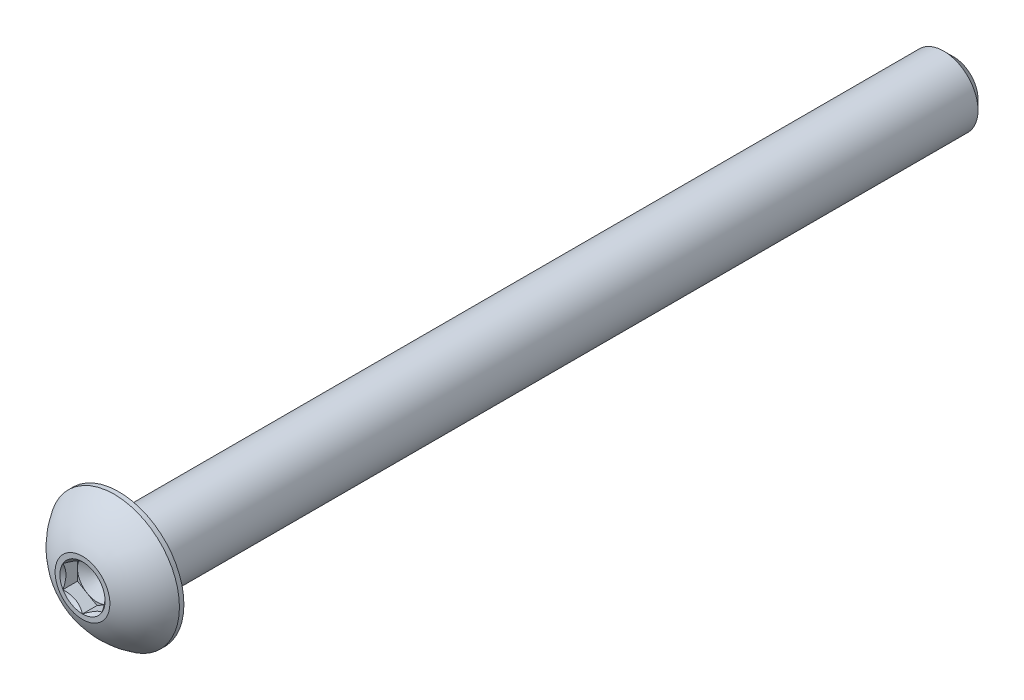
ISO-10303-21;
HEADER;
FILE_DESCRIPTION(('STEP AP214'),'2;1');
FILE_NAME('part.step','',(''),(''),'','','');
FILE_SCHEMA(('AUTOMOTIVE_DESIGN { 1 0 10303 214 1 1 1 1 }'));
ENDSEC;
DATA;
#1=APPLICATION_CONTEXT('core data for automotive mechanical design processes');
#2=APPLICATION_PROTOCOL_DEFINITION('international standard','automotive_design',2000,#1);
#3=PRODUCT_CONTEXT('',#1,'mechanical');
#4=PRODUCT('Part','Part','',(#3));
#5=PRODUCT_RELATED_PRODUCT_CATEGORY('part','',(#4));
#6=PRODUCT_DEFINITION_FORMATION('','',#4);
#7=PRODUCT_DEFINITION_CONTEXT('part definition',#1,'design');
#8=PRODUCT_DEFINITION('design','',#6,#7);
#9=PRODUCT_DEFINITION_SHAPE('','',#8);
#10=(LENGTH_UNIT() NAMED_UNIT(*) SI_UNIT(.MILLI.,.METRE.));
#11=(NAMED_UNIT(*) PLANE_ANGLE_UNIT() SI_UNIT($,.RADIAN.));
#12=(NAMED_UNIT(*) SI_UNIT($,.STERADIAN.) SOLID_ANGLE_UNIT());
#13=UNCERTAINTY_MEASURE_WITH_UNIT(LENGTH_MEASURE(1.E-05),#10,'distance_accuracy_value','');
#14=(GEOMETRIC_REPRESENTATION_CONTEXT(3) GLOBAL_UNCERTAINTY_ASSIGNED_CONTEXT((#13)) GLOBAL_UNIT_ASSIGNED_CONTEXT((#10,
#11,#12)) REPRESENTATION_CONTEXT('',''));
#15=CARTESIAN_POINT('',(0.,0.,0.));
#16=DIRECTION('',(0.,0.,1.));
#17=DIRECTION('',(1.,0.,0.));
#18=AXIS2_PLACEMENT_3D('',#15,#16,#17);
#19=CARTESIAN_POINT('',(0.,1.190625,26.5049));
#20=DIRECTION('',(0.,0.,-1.));
#21=DIRECTION('',(-1.,0.,0.));
#22=AXIS2_PLACEMENT_3D('',#19,#20,#21);
#23=PLANE('',#22);
#24=CARTESIAN_POINT('',(0.,0.,26.5049));
#25=DIRECTION('',(0.,0.,1.));
#26=DIRECTION('',(1.,0.,0.));
#27=AXIS2_PLACEMENT_3D('',#24,#25,#26);
#28=CIRCLE('',#27,1.666875);
#29=CARTESIAN_POINT('',(0.,1.66687500000001,26.5049));
#30=VERTEX_POINT('',#29);
#31=EDGE_CURVE('E167',#30,#30,#28,.T.);
#32=ORIENTED_EDGE('',*,*,#31,.T.);
#33=EDGE_LOOP('',(#32));
#34=FACE_BOUND('',#33,.T.);
#35=CARTESIAN_POINT('',(0.,0.,26.5049));
#36=DIRECTION('',(0.,0.,1.));
#37=DIRECTION('',(1.,0.,0.));
#38=AXIS2_PLACEMENT_3D('',#35,#36,#37);
#39=CIRCLE('',#38,1.3748153285078);
#40=CARTESIAN_POINT('',(0.,1.3748153285078,26.5049));
#41=VERTEX_POINT('',#40);
#42=CARTESIAN_POINT('',(-1.190625,0.687407664253898,26.5049));
#43=VERTEX_POINT('',#42);
#44=EDGE_CURVE('E121',#41,#43,#39,.T.);
#45=ORIENTED_EDGE('',*,*,#44,.F.);
#46=CARTESIAN_POINT('',(0.,0.,26.5049));
#47=DIRECTION('',(0.,0.,1.));
#48=DIRECTION('',(1.,0.,0.));
#49=AXIS2_PLACEMENT_3D('',#46,#47,#48);
#50=CIRCLE('',#49,1.3748153285078);
#51=CARTESIAN_POINT('',(1.190625,0.687407664253897,26.5049));
#52=VERTEX_POINT('',#51);
#53=EDGE_CURVE('E106',#52,#41,#50,.T.);
#54=ORIENTED_EDGE('',*,*,#53,.F.);
#55=CARTESIAN_POINT('',(0.,0.,26.5049));
#56=DIRECTION('',(0.,0.,1.));
#57=DIRECTION('',(1.,0.,0.));
#58=AXIS2_PLACEMENT_3D('',#55,#56,#57);
#59=CIRCLE('',#58,1.3748153285078);
#60=CARTESIAN_POINT('',(1.190625,-0.687407664253896,26.5049));
#61=VERTEX_POINT('',#60);
#62=EDGE_CURVE('E117',#61,#52,#59,.T.);
#63=ORIENTED_EDGE('',*,*,#62,.F.);
#64=CARTESIAN_POINT('',(0.,0.,26.5049));
#65=DIRECTION('',(0.,0.,1.));
#66=DIRECTION('',(1.,0.,0.));
#67=AXIS2_PLACEMENT_3D('',#64,#65,#66);
#68=CIRCLE('',#67,1.3748153285078);
#69=CARTESIAN_POINT('',(0.,-1.3748153285078,26.5049));
#70=VERTEX_POINT('',#69);
#71=EDGE_CURVE('E138',#70,#61,#68,.T.);
#72=ORIENTED_EDGE('',*,*,#71,.F.);
#73=CARTESIAN_POINT('',(0.,0.,26.5049));
#74=DIRECTION('',(0.,0.,1.));
#75=DIRECTION('',(1.,0.,0.));
#76=AXIS2_PLACEMENT_3D('',#73,#74,#75);
#77=CIRCLE('',#76,1.3748153285078);
#78=CARTESIAN_POINT('',(-1.190625,-0.6874076642539,26.5049));
#79=VERTEX_POINT('',#78);
#80=EDGE_CURVE('E438',#79,#70,#77,.T.);
#81=ORIENTED_EDGE('',*,*,#80,.F.);
#82=CARTESIAN_POINT('',(0.,0.,26.5049));
#83=DIRECTION('',(0.,0.,1.));
#84=DIRECTION('',(1.,0.,0.));
#85=AXIS2_PLACEMENT_3D('',#82,#83,#84);
#86=CIRCLE('',#85,1.3748153285078);
#87=EDGE_CURVE('E447',#43,#79,#86,.T.);
#88=ORIENTED_EDGE('',*,*,#87,.F.);
#89=EDGE_LOOP('',(#45,#54,#63,#72,#81,#88));
#90=FACE_BOUND('',#89,.T.);
#91=ADVANCED_FACE('F33',(#34,#90),#23,.F.);
#92=CARTESIAN_POINT('',(0.,0.,-26.5049));
#93=DIRECTION('',(0.,0.,1.));
#94=DIRECTION('',(1.,0.,0.));
#95=AXIS2_PLACEMENT_3D('',#92,#93,#94);
#96=CONICAL_SURFACE('',#95,1.4874875,0.785398163397447);
#97=CARTESIAN_POINT('',(0.,0.,-25.9095875));
#98=DIRECTION('',(0.,0.,1.));
#99=DIRECTION('',(1.,0.,0.));
#100=AXIS2_PLACEMENT_3D('',#97,#98,#99);
#101=CIRCLE('',#100,2.0828);
#102=CARTESIAN_POINT('',(2.0828,0.,-25.9095875));
#103=VERTEX_POINT('',#102);
#104=EDGE_CURVE('E11',#103,#103,#101,.T.);
#105=ORIENTED_EDGE('',*,*,#104,.F.);
#106=EDGE_LOOP('',(#105));
#107=FACE_BOUND('',#106,.T.);
#108=CARTESIAN_POINT('',(0.,0.,-26.5049));
#109=DIRECTION('',(0.,0.,1.));
#110=DIRECTION('',(1.,0.,0.));
#111=AXIS2_PLACEMENT_3D('',#108,#109,#110);
#112=CIRCLE('',#111,1.4874875);
#113=CARTESIAN_POINT('',(1.4874875,0.,-26.5049));
#114=VERTEX_POINT('',#113);
#115=EDGE_CURVE('E160',#114,#114,#112,.T.);
#116=ORIENTED_EDGE('',*,*,#115,.T.);
#117=EDGE_LOOP('',(#116));
#118=FACE_BOUND('',#117,.T.);
#119=ADVANCED_FACE('F35',(#107,#118),#96,.T.);
#120=CARTESIAN_POINT('',(0.,0.,26.5049));
#121=DIRECTION('',(0.,0.,1.));
#122=DIRECTION('',(1.,0.,0.));
#123=AXIS2_PLACEMENT_3D('',#120,#121,#122);
#124=CYLINDRICAL_SURFACE('',#123,2.0828);
#125=CARTESIAN_POINT('',(0.,0.,24.2951));
#126=DIRECTION('',(0.,0.,1.));
#127=DIRECTION('',(1.,0.,0.));
#128=AXIS2_PLACEMENT_3D('',#125,#126,#127);
#129=CIRCLE('',#128,2.0828);
#130=CARTESIAN_POINT('',(2.0828,0.,24.2951));
#131=VERTEX_POINT('',#130);
#132=EDGE_CURVE('E41',#131,#131,#129,.T.);
#133=ORIENTED_EDGE('',*,*,#132,.F.);
#134=EDGE_LOOP('',(#133));
#135=FACE_BOUND('',#134,.T.);
#136=ORIENTED_EDGE('',*,*,#104,.T.);
#137=EDGE_LOOP('',(#136));
#138=FACE_BOUND('',#137,.T.);
#139=ADVANCED_FACE('F181',(#135,#138),#124,.T.);
#140=CARTESIAN_POINT('',(0.,3.9624,24.2951));
#141=DIRECTION('',(0.,0.,1.));
#142=DIRECTION('',(1.,0.,0.));
#143=AXIS2_PLACEMENT_3D('',#140,#141,#142);
#144=PLANE('',#143);
#145=CARTESIAN_POINT('',(0.,0.,24.2951));
#146=DIRECTION('',(0.,0.,1.));
#147=DIRECTION('',(1.,0.,0.));
#148=AXIS2_PLACEMENT_3D('',#145,#146,#147);
#149=CIRCLE('',#148,3.9624);
#150=CARTESIAN_POINT('',(3.9624,0.,24.2951));
#151=VERTEX_POINT('',#150);
#152=EDGE_CURVE('E174',#151,#151,#149,.T.);
#153=ORIENTED_EDGE('',*,*,#152,.F.);
#154=EDGE_LOOP('',(#153));
#155=FACE_BOUND('',#154,.T.);
#156=ORIENTED_EDGE('',*,*,#132,.T.);
#157=EDGE_LOOP('',(#156));
#158=FACE_BOUND('',#157,.T.);
#159=ADVANCED_FACE('F179',(#155,#158),#144,.F.);
#160=CARTESIAN_POINT('',(0.,0.,26.5049));
#161=DIRECTION('',(0.,0.,1.));
#162=DIRECTION('',(1.,0.,0.));
#163=AXIS2_PLACEMENT_3D('',#160,#161,#162);
#164=CYLINDRICAL_SURFACE('',#163,3.9624);
#165=CARTESIAN_POINT('',(0.,0.,24.5672428571429));
#166=DIRECTION('',(0.,0.,1.));
#167=DIRECTION('',(1.,0.,0.));
#168=AXIS2_PLACEMENT_3D('',#165,#166,#167);
#169=CIRCLE('',#168,3.9624);
#170=CARTESIAN_POINT('',(0.,3.9624,24.5672428571429));
#171=VERTEX_POINT('',#170);
#172=EDGE_CURVE('E171',#171,#171,#169,.T.);
#173=ORIENTED_EDGE('',*,*,#172,.F.);
#174=EDGE_LOOP('',(#173));
#175=FACE_BOUND('',#174,.T.);
#176=ORIENTED_EDGE('',*,*,#152,.T.);
#177=EDGE_LOOP('',(#176));
#178=FACE_BOUND('',#177,.T.);
#179=ADVANCED_FACE('F200',(#175,#178),#164,.T.);
#180=CARTESIAN_POINT('',(0.,0.,22.2015956824338));
#181=DIRECTION('',(0.,0.,1.));
#182=DIRECTION('',(0.,1.,0.));
#183=AXIS2_PLACEMENT_3D('',#180,#181,#182);
#184=SPHERICAL_SURFACE('',#183,4.61485647828933);
#185=CARTESIAN_POINT('',(0.,1.66687500000001,26.5049));
#186=CARTESIAN_POINT('',(0.,1.69659544142796,26.4933879101518));
#187=CARTESIAN_POINT('',(0.,1.72619658358825,26.4815678352273));
#188=CARTESIAN_POINT('',(0.,1.78514764747728,26.4573169960083));
#189=CARTESIAN_POINT('',(0.,1.81449756920602,26.4448862317139));
#190=CARTESIAN_POINT('',(0.,1.87293357033575,26.4194192945378));
#191=CARTESIAN_POINT('',(0.,1.90201964973674,26.4063831216561));
#192=CARTESIAN_POINT('',(0.,1.95991548647109,26.3797109782168));
#193=CARTESIAN_POINT('',(0.,1.98872524380446,26.3660750076592));
#194=CARTESIAN_POINT('',(0.,2.04605606753841,26.3382091184341));
#195=CARTESIAN_POINT('',(0.,2.07457713393898,26.3239791997667));
#196=CARTESIAN_POINT('',(0.,2.13131833294382,26.2949315238966));
#197=CARTESIAN_POINT('',(0.,2.15953846554809,26.2801137666941));
#198=CARTESIAN_POINT('',(0.,2.21566568272341,26.2498967743201));
#199=CARTESIAN_POINT('',(0.,2.24357276729446,26.2344975391486));
#200=CARTESIAN_POINT('',(0.,2.29906190869825,26.2031242013775));
#201=CARTESIAN_POINT('',(0.,2.32664396553098,26.1871500987778));
#202=CARTESIAN_POINT('',(0.,2.38147121123847,26.1546338833683));
#203=CARTESIAN_POINT('',(0.,2.40871640011324,26.1380917705586));
#204=CARTESIAN_POINT('',(0.,2.46285821430391,26.1044466358044));
#205=CARTESIAN_POINT('',(0.,2.48975483961981,26.0873436138599));
#206=CARTESIAN_POINT('',(0.,2.54318798071768,26.0525840026871));
#207=CARTESIAN_POINT('',(0.,2.56972449649964,26.0349274134588));
#208=CARTESIAN_POINT('',(0.,2.6224260271403,25.9990682472024));
#209=CARTESIAN_POINT('',(0.,2.64859104199901,25.9808656701742));
#210=CARTESIAN_POINT('',(0.,2.70053833887869,25.943922342179));
#211=CARTESIAN_POINT('',(0.,2.72632062089967,25.9251815912118));
#212=CARTESIAN_POINT('',(0.,2.77749138448606,25.8871699602226));
#213=CARTESIAN_POINT('',(0.,2.80287986605148,25.8678990802006));
#214=CARTESIAN_POINT('',(0.,2.85325213015648,25.8288354635553));
#215=CARTESIAN_POINT('',(0.,2.87823591269608,25.8090427269321));
#216=CARTESIAN_POINT('',(0.,2.92778805390526,25.7689438935568));
#217=CARTESIAN_POINT('',(0.,2.95235641257484,25.7486377968048));
#218=CARTESIAN_POINT('',(0.,3.00106715952974,25.7075209600153));
#219=CARTESIAN_POINT('',(0.,3.02520954781505,25.686710219978));
#220=CARTESIAN_POINT('',(0.,3.0730579903444,25.6445930300909));
#221=CARTESIAN_POINT('',(0.,3.09676404458844,25.6232865802411));
#222=CARTESIAN_POINT('',(0.,3.14372964268434,25.5801871169966));
#223=CARTESIAN_POINT('',(0.,3.1669891865362,25.5583941036018));
#224=CARTESIAN_POINT('',(0.,3.21305177917134,25.5143308684028));
#225=CARTESIAN_POINT('',(0.,3.23585482795462,25.4920606465986));
#226=CARTESIAN_POINT('',(0.,3.28099464173685,25.4470525545686));
#227=CARTESIAN_POINT('',(0.,3.3033314067358,25.4243146843429));
#228=CARTESIAN_POINT('',(0.,3.3475290643964,25.3783810562063));
#229=CARTESIAN_POINT('',(0.,3.36938995705805,25.3551852982954));
#230=CARTESIAN_POINT('',(0.,3.41262648576942,25.3083458520833));
#231=CARTESIAN_POINT('',(0.,3.43400212181915,25.284702163782));
#232=CARTESIAN_POINT('',(0.,3.47625896134093,25.2369770063688));
#233=CARTESIAN_POINT('',(0.,3.49714016481299,25.2128955372568));
#234=CARTESIAN_POINT('',(0.,3.53839917545351,25.1643051557252));
#235=CARTESIAN_POINT('',(0.,3.55877698262196,25.1397962433055));
#236=CARTESIAN_POINT('',(0.,3.59902045304723,25.0903614961659));
#237=CARTESIAN_POINT('',(0.,3.61888611630403,25.0654356614459));
#238=CARTESIAN_POINT('',(0.,3.65809677105815,25.0151777696305));
#239=CARTESIAN_POINT('',(0.,3.67744176255547,24.9898457125351));
#240=CARTESIAN_POINT('',(0.,3.71560276978466,24.9387862504814));
#241=CARTESIAN_POINT('',(0.,3.73441878551654,24.9130588455231));
#242=CARTESIAN_POINT('',(0.,3.77151376304466,24.8612197311933));
#243=CARTESIAN_POINT('',(0.,3.78979272484091,24.8351080218217));
#244=CARTESIAN_POINT('',(0.,3.82580575149333,24.7825115099777));
#245=CARTESIAN_POINT('',(0.,3.8435398163495,24.7560267075054));
#246=CARTESIAN_POINT('',(0.,3.87845542277172,24.7026953701386));
#247=CARTESIAN_POINT('',(0.,3.89563696433778,24.6758488352441));
#248=CARTESIAN_POINT('',(0.,3.92944019940812,24.6218055892715));
#249=CARTESIAN_POINT('',(0.,3.94606189291241,24.5946088781934));
#250=CARTESIAN_POINT('',(0.,3.9624,24.5672428571429));
#251=B_SPLINE_CURVE_WITH_KNOTS('',3,(#185,#186,#187,#188,#189,#190,#191,#192,#193,#194,#195,
#196,#197,#198,#199,#200,#201,#202,#203,#204,#205,#206,#207,#208,#209,#210,#211,#212,#213,#214,
#215,#216,#217,#218,#219,#220,#221,#222,#223,#224,#225,#226,#227,#228,#229,#230,#231,#232,#233,
#234,#235,#236,#237,#238,#239,#240,#241,#242,#243,#244,#245,#246,#247,#248,#249,#250),
.UNSPECIFIED.,.F.,.F.,(4,2,2,2,2,2,2,2,2,2,2,2,2,2,2,2,2,2,2,2,2,2,2,2,2,2,2,2,2,2,2,2,4),(0.,
0.0956146851543019,0.191229370308603,0.286844055462906,0.382458740617208,0.478073425771509,
0.573688110925813,0.669302796080113,0.764917481234416,0.860532166388717,0.95614685154302,
1.05176153669732,1.14737622185162,1.24299090700592,1.33860559216023,1.43422027731453,
1.52983496246883,1.62544964762313,1.72106433277744,1.81667901793174,1.91229370308604,
2.00790838824034,2.10352307339464,2.19913775854895,2.29475244370325,2.39036712885755,
2.48598181401185,2.58159649916615,2.67721118432045,2.77282586947476,2.86844055462906,
2.96405523978336,3.05966992493766),.UNSPECIFIED.);
#252=EDGE_CURVE('BSEAM192',#30,#171,#251,.T.);
#253=ORIENTED_EDGE('',*,*,#31,.F.);
#254=ORIENTED_EDGE('',*,*,#172,.T.);
#255=ORIENTED_EDGE('',*,*,#252,.T.);
#256=ORIENTED_EDGE('',*,*,#252,.F.);
#257=EDGE_LOOP('',(#253,#255,#254,#256));
#258=FACE_BOUND('',#257,.T.);
#259=ADVANCED_FACE('F192',(#258),#184,.T.);
#260=CARTESIAN_POINT('',(0.,1.4874875,-26.5049));
#261=DIRECTION('',(0.,0.,1.));
#262=DIRECTION('',(1.,0.,0.));
#263=AXIS2_PLACEMENT_3D('',#260,#261,#262);
#264=PLANE('',#263);
#265=ORIENTED_EDGE('',*,*,#115,.F.);
#266=EDGE_LOOP('',(#265));
#267=FACE_BOUND('',#266,.T.);
#268=ADVANCED_FACE('F190',(#267),#264,.F.);
#269=CARTESIAN_POINT('',(1.190625,0.687407664253899,26.5049));
#270=DIRECTION('',(-0.499999999999999,-0.866025403784439,0.));
#271=DIRECTION('',(0.866025403784439,-0.499999999999999,0.));
#272=AXIS2_PLACEMENT_3D('',#269,#270,#271);
#273=PLANE('',#272);
#274=CARTESIAN_POINT('',(1.190825,0.687292194200061,26.5050154846));
#275=CARTESIAN_POINT('',(1.14989058041014,0.710925692369386,26.4813987642143));
#276=CARTESIAN_POINT('',(1.10827161169803,0.734954415158721,26.4591687817231));
#277=CARTESIAN_POINT('',(1.02340555632637,0.78395185507261,26.4184656626274));
#278=CARTESIAN_POINT('',(0.980150392709039,0.808925235430916,26.4000151826476));
#279=CARTESIAN_POINT('',(0.892928352542575,0.859282903800292,26.3684088380043));
#280=CARTESIAN_POINT('',(0.848983705042075,0.884654357864149,26.3551735042433));
#281=CARTESIAN_POINT('',(0.760126625836306,0.935956016463003,26.3347814515754));
#282=CARTESIAN_POINT('',(0.715216911165245,0.96188465231757,26.327609502896));
#283=CARTESIAN_POINT('',(0.637820872343021,1.00656927616579,26.3211385386489));
#284=CARTESIAN_POINT('',(0.605434587484353,1.025267506447,26.3201803201468));
#285=CARTESIAN_POINT('',(0.54071892668223,1.06263111063189,26.3217926490721));
#286=CARTESIAN_POINT('',(0.508389564872727,1.08129647637533,26.3243639751796));
#287=CARTESIAN_POINT('',(0.444042843928515,1.11844707303394,26.3328867539936));
#288=CARTESIAN_POINT('',(0.412025803663231,1.13693211984976,26.3388413547526));
#289=CARTESIAN_POINT('',(0.348526236603542,1.17359361198509,26.3538099640712));
#290=CARTESIAN_POINT('',(0.317043945355835,1.19176992131166,26.3628252859121));
#291=CARTESIAN_POINT('',(0.236410161427874,1.23832385816825,26.389582295838));
#292=CARTESIAN_POINT('',(0.187767164732343,1.2664079054046,26.409336814436));
#293=CARTESIAN_POINT('',(0.0923855836478813,1.32147648691945,26.4538367689577));
#294=CARTESIAN_POINT('',(0.0456413824128437,1.34846426408555,26.4785659647162));
#295=CARTESIAN_POINT('',(-0.00020000000000096,1.37493079856163,26.5050154846));
#296=B_SPLINE_CURVE_WITH_KNOTS('',3,(#274,#275,#276,#277,#278,#279,#280,#281,#282,#283,#284,
#285,#286,#287,#288,#289,#290,#291,#292,#293,#294,#295),.UNSPECIFIED.,.F.,.F.,(4,2,2,2,2,2,2,2,
2,2,4),(0.,0.15862567293412,0.318176079843272,0.475191357500657,0.631811068630749,
0.743878551794719,0.85597076300703,0.968167444423243,1.08041232768377,1.25873351645467,
1.43648174479847),.UNSPECIFIED.);
#297=EDGE_CURVE('E103',#52,#41,#296,.T.);
#298=ORIENTED_EDGE('',*,*,#297,.T.);
#299=DIRECTION('',(0.,0.,-1.));
#300=VECTOR('',#299,1.);
#301=CARTESIAN_POINT('',(0.,1.3748153285078,26.5049));
#302=LINE('',#301,#300);
#303=CARTESIAN_POINT('',(0.,1.3748153285078,25.62098));
#304=VERTEX_POINT('',#303);
#305=EDGE_CURVE('E158',#41,#304,#302,.T.);
#306=ORIENTED_EDGE('',*,*,#305,.T.);
#307=DIRECTION('',(-0.866025403784439,0.499999999999999,0.));
#308=VECTOR('',#307,1.);
#309=CARTESIAN_POINT('',(1.190625,0.687407664253899,25.62098));
#310=LINE('',#309,#308);
#311=CARTESIAN_POINT('',(0.595312499999999,1.03111149638085,25.62098));
#312=VERTEX_POINT('',#311);
#313=EDGE_CURVE('E474',#312,#304,#310,.T.);
#314=ORIENTED_EDGE('',*,*,#313,.F.);
#315=CARTESIAN_POINT('',(1.190625,0.687407664253899,25.62098));
#316=VERTEX_POINT('',#315);
#317=EDGE_CURVE('E48',#316,#312,#310,.T.);
#318=ORIENTED_EDGE('',*,*,#317,.F.);
#319=DIRECTION('',(0.,0.,-1.));
#320=VECTOR('',#319,1.);
#321=CARTESIAN_POINT('',(1.190625,0.687407664253899,26.5049));
#322=LINE('',#321,#320);
#323=EDGE_CURVE('E134',#52,#316,#322,.T.);
#324=ORIENTED_EDGE('',*,*,#323,.F.);
#325=EDGE_LOOP('',(#298,#306,#314,#318,#324));
#326=FACE_BOUND('',#325,.T.);
#327=ADVANCED_FACE('F140',(#326),#273,.T.);
#328=CARTESIAN_POINT('',(0.,1.3748153285078,26.5049));
#329=DIRECTION('',(0.5,-0.866025403784439,0.));
#330=DIRECTION('',(0.866025403784439,0.5,0.));
#331=AXIS2_PLACEMENT_3D('',#328,#329,#330);
#332=PLANE('',#331);
#333=CARTESIAN_POINT('',(0.00019999999999949,1.37493079856163,26.5050154846));
#334=CARTESIAN_POINT('',(-0.0407344195898564,1.35129730039231,26.4813987642143));
#335=CARTESIAN_POINT('',(-0.082353388301974,1.32726857760297,26.4591687817231));
#336=CARTESIAN_POINT('',(-0.167219443673633,1.27827113768908,26.4184656626274));
#337=CARTESIAN_POINT('',(-0.210474607290962,1.25329775733078,26.4000151826476));
#338=CARTESIAN_POINT('',(-0.297696647457426,1.2029400889614,26.3684088380043));
#339=CARTESIAN_POINT('',(-0.341641294957927,1.17756863489755,26.3551735042433));
#340=CARTESIAN_POINT('',(-0.430498374163695,1.12626697629869,26.3347814515754));
#341=CARTESIAN_POINT('',(-0.475408088834756,1.10033834044412,26.327609502896));
#342=CARTESIAN_POINT('',(-0.552804127656979,1.0556537165959,26.3211385386489));
#343=CARTESIAN_POINT('',(-0.585190412515647,1.0369554863147,26.3201803201468));
#344=CARTESIAN_POINT('',(-0.649906073317771,0.999591882129809,26.3217926490721));
#345=CARTESIAN_POINT('',(-0.682235435127273,0.980926516386364,26.3243639751796));
#346=CARTESIAN_POINT('',(-0.746582156071486,0.943775919727753,26.3328867539936));
#347=CARTESIAN_POINT('',(-0.778599196336769,0.925290872911937,26.3388413547526));
#348=CARTESIAN_POINT('',(-0.842098763396458,0.8886293807766,26.3538099640712));
#349=CARTESIAN_POINT('',(-0.873581054644165,0.87045307145003,26.3628252859121));
#350=CARTESIAN_POINT('',(-0.954214838572128,0.823899134593443,26.389582295838));
#351=CARTESIAN_POINT('',(-1.00285783526766,0.795815087357088,26.409336814436));
#352=CARTESIAN_POINT('',(-1.09823941635212,0.740746505842242,26.4538367689577));
#353=CARTESIAN_POINT('',(-1.14498361758716,0.71375872867614,26.4785659647162));
#354=CARTESIAN_POINT('',(-1.190825,0.68729219420006,26.5050154846));
#355=B_SPLINE_CURVE_WITH_KNOTS('',3,(#333,#334,#335,#336,#337,#338,#339,#340,#341,#342,#343,
#344,#345,#346,#347,#348,#349,#350,#351,#352,#353,#354),.UNSPECIFIED.,.F.,.F.,(4,2,2,2,2,2,2,2,
2,2,4),(0.,0.158625672934121,0.318176079843273,0.475191357500658,0.631811068630749,
0.743878551794719,0.85597076300703,0.968167444423243,1.08041232768377,1.25873351645467,
1.43648174479847),.UNSPECIFIED.);
#356=EDGE_CURVE('E462',#41,#43,#355,.T.);
#357=ORIENTED_EDGE('',*,*,#356,.T.);
#358=DIRECTION('',(0.,0.,-1.));
#359=VECTOR('',#358,1.);
#360=CARTESIAN_POINT('',(-1.190625,0.687407664253898,26.5049));
#361=LINE('',#360,#359);
#362=CARTESIAN_POINT('',(-1.190625,0.687407664253898,25.62098));
#363=VERTEX_POINT('',#362);
#364=EDGE_CURVE('E155',#43,#363,#361,.T.);
#365=ORIENTED_EDGE('',*,*,#364,.T.);
#366=DIRECTION('',(-0.866025403784438,-0.5,0.));
#367=VECTOR('',#366,1.);
#368=CARTESIAN_POINT('',(0.,1.3748153285078,25.62098));
#369=LINE('',#368,#367);
#370=CARTESIAN_POINT('',(-0.5953125,1.03111149638085,25.62098));
#371=VERTEX_POINT('',#370);
#372=EDGE_CURVE('E476',#371,#363,#369,.T.);
#373=ORIENTED_EDGE('',*,*,#372,.F.);
#374=EDGE_CURVE('E477',#304,#371,#369,.T.);
#375=ORIENTED_EDGE('',*,*,#374,.F.);
#376=ORIENTED_EDGE('',*,*,#305,.F.);
#377=EDGE_LOOP('',(#357,#365,#373,#375,#376));
#378=FACE_BOUND('',#377,.T.);
#379=ADVANCED_FACE('F198',(#378),#332,.T.);
#380=CARTESIAN_POINT('',(-1.190625,0.687407664253898,26.5049));
#381=DIRECTION('',(1.,0.,0.));
#382=DIRECTION('',(0.,0.,-1.));
#383=AXIS2_PLACEMENT_3D('',#380,#381,#382);
#384=PLANE('',#383);
#385=CARTESIAN_POINT('',(-1.190625,-1.33257496176315,26.9170776539471));
#386=CARTESIAN_POINT('',(-1.190625,-1.29994871423567,26.8927517507382));
#387=CARTESIAN_POINT('',(-1.190625,-1.26713658172592,26.8686758153419));
#388=CARTESIAN_POINT('',(-1.190625,-1.20106652666898,26.8211258905442));
#389=CARTESIAN_POINT('',(-1.190625,-1.16780849029641,26.7976520594744));
#390=CARTESIAN_POINT('',(-1.190625,-1.06676850998873,26.7279528021059));
#391=CARTESIAN_POINT('',(-1.190625,-0.998216816413861,26.6828244430562));
#392=CARTESIAN_POINT('',(-1.190625,-0.854708873099824,26.5945746038978));
#393=CARTESIAN_POINT('',(-1.190625,-0.779606053905837,26.5516886379598));
#394=CARTESIAN_POINT('',(-1.190625,-0.625699933788274,26.4734827621873));
#395=CARTESIAN_POINT('',(-1.190625,-0.546910204142432,26.4381374138711));
#396=CARTESIAN_POINT('',(-1.190625,-0.428270822863891,26.3949081103375));
#397=CARTESIAN_POINT('',(-1.190625,-0.390097157889893,26.3824393065679));
#398=CARTESIAN_POINT('',(-1.190625,-0.312861852648325,26.3605717414076));
#399=CARTESIAN_POINT('',(-1.190625,-0.273800148194846,26.3511732026896));
#400=CARTESIAN_POINT('',(-1.190625,-0.19565680432425,26.3360809931601));
#401=CARTESIAN_POINT('',(-1.190625,-0.156587167585192,26.3303261223414));
#402=CARTESIAN_POINT('',(-1.190625,-0.0780721925504554,26.3226274936869));
#403=CARTESIAN_POINT('',(-1.190625,-0.0386269124664328,26.3206831547062));
#404=CARTESIAN_POINT('',(-1.190625,0.0389916055329472,26.3207358865562));
#405=CARTESIAN_POINT('',(-1.190625,0.0771649838909024,26.3226082985348));
#406=CARTESIAN_POINT('',(-1.190625,0.153169316901308,26.329925032677));
#407=CARTESIAN_POINT('',(-1.190625,0.191000202066013,26.3353700639159));
#408=CARTESIAN_POINT('',(-1.190625,0.266679875667626,26.3496337404319));
#409=CARTESIAN_POINT('',(-1.190625,0.304517960496566,26.3585083513185));
#410=CARTESIAN_POINT('',(-1.190625,0.379371812103033,26.3791711899478));
#411=CARTESIAN_POINT('',(-1.190625,0.41638766004582,26.3909591287024));
#412=CARTESIAN_POINT('',(-1.190625,0.534752604370335,26.4330388624574));
#413=CARTESIAN_POINT('',(-1.190625,0.614367820141192,26.4681973626664));
#414=CARTESIAN_POINT('',(-1.190625,0.769840121594399,26.5463109296483));
#415=CARTESIAN_POINT('',(-1.190625,0.845682198950469,26.5892943854746));
#416=CARTESIAN_POINT('',(-1.190625,0.990597219171114,26.6779106157189));
#417=CARTESIAN_POINT('',(-1.190625,1.05981896192243,26.7233030277464));
#418=CARTESIAN_POINT('',(-1.190625,1.16180435559073,26.7934487362735));
#419=CARTESIAN_POINT('',(-1.190625,1.19535834820321,26.8170729140236));
#420=CARTESIAN_POINT('',(-1.190625,1.26200934527367,26.8649391402926));
#421=CARTESIAN_POINT('',(-1.190625,1.2951064717025,26.8891810187836));
#422=CARTESIAN_POINT('',(-1.190625,1.32801361492664,26.9136788103185));
#423=B_SPLINE_CURVE_WITH_KNOTS('',3,(#385,#386,#387,#388,#389,#390,#391,#392,#393,#394,#395,
#396,#397,#398,#399,#400,#401,#402,#403,#404,#405,#406,#407,#408,#409,#410,#411,#412,#413,#414,
#415,#416,#417,#418,#419,#420,#421,#422),.UNSPECIFIED.,.F.,.F.,(4,2,2,2,2,2,2,2,2,2,2,2,2,2,2,2,
2,2,4),(0.,0.122086892163024,0.244205566236856,0.490307097949239,0.749538212338043,
1.00788046850429,1.12825296528966,1.24863419022022,1.36693571627758,1.48521919874151,
1.59970134751388,1.71420622500211,1.83066442982697,1.94711108719178,2.20743843130379,
2.46872978374271,2.71694010916469,2.84004418874365,2.96311474121228),.UNSPECIFIED.);
#424=EDGE_CURVE('E455',#43,#79,#423,.F.);
#425=ORIENTED_EDGE('',*,*,#424,.T.);
#426=DIRECTION('',(0.,0.,-1.));
#427=VECTOR('',#426,1.);
#428=CARTESIAN_POINT('',(-1.190625,-0.687407664253899,26.5049));
#429=LINE('',#428,#427);
#430=CARTESIAN_POINT('',(-1.190625,-0.687407664253899,25.62098));
#431=VERTEX_POINT('',#430);
#432=EDGE_CURVE('E152',#79,#431,#429,.T.);
#433=ORIENTED_EDGE('',*,*,#432,.T.);
#434=DIRECTION('',(0.,-1.,0.));
#435=VECTOR('',#434,1.);
#436=CARTESIAN_POINT('',(-1.190625,0.687407664253898,25.62098));
#437=LINE('',#436,#435);
#438=CARTESIAN_POINT('',(-1.190625,0.,25.62098));
#439=VERTEX_POINT('',#438);
#440=EDGE_CURVE('E480',#439,#431,#437,.T.);
#441=ORIENTED_EDGE('',*,*,#440,.F.);
#442=EDGE_CURVE('E481',#363,#439,#437,.T.);
#443=ORIENTED_EDGE('',*,*,#442,.F.);
#444=ORIENTED_EDGE('',*,*,#364,.F.);
#445=EDGE_LOOP('',(#425,#433,#441,#443,#444));
#446=FACE_BOUND('',#445,.T.);
#447=ADVANCED_FACE('F319',(#446),#384,.T.);
#448=CARTESIAN_POINT('',(-1.190625,-0.687407664253899,26.5049));
#449=DIRECTION('',(0.499999999999999,0.866025403784439,0.));
#450=DIRECTION('',(-0.866025403784439,0.499999999999999,0.));
#451=AXIS2_PLACEMENT_3D('',#448,#449,#450);
#452=PLANE('',#451);
#453=CARTESIAN_POINT('',(-1.190825,-0.687292194200061,26.5050154846));
#454=CARTESIAN_POINT('',(-1.14989058041014,-0.710925692369386,26.4813987642143));
#455=CARTESIAN_POINT('',(-1.10827161169803,-0.734954415158721,26.4591687817231));
#456=CARTESIAN_POINT('',(-1.02340555632637,-0.78395185507261,26.4184656626274));
#457=CARTESIAN_POINT('',(-0.980150392709039,-0.808925235430916,26.4000151826476));
#458=CARTESIAN_POINT('',(-0.892928352542576,-0.859282903800292,26.3684088380043));
#459=CARTESIAN_POINT('',(-0.848983705042075,-0.884654357864149,26.3551735042433));
#460=CARTESIAN_POINT('',(-0.760126625836307,-0.935956016463003,26.3347814515754));
#461=CARTESIAN_POINT('',(-0.715216911165246,-0.96188465231757,26.327609502896));
#462=CARTESIAN_POINT('',(-0.637820872343023,-1.00656927616579,26.3211385386489));
#463=CARTESIAN_POINT('',(-0.605434587484354,-1.02526750644699,26.3201803201468));
#464=CARTESIAN_POINT('',(-0.540718926682231,-1.06263111063189,26.3217926490721));
#465=CARTESIAN_POINT('',(-0.508389564872728,-1.08129647637533,26.3243639751796));
#466=CARTESIAN_POINT('',(-0.444042843928516,-1.11844707303394,26.3328867539936));
#467=CARTESIAN_POINT('',(-0.412025803663233,-1.13693211984976,26.3388413547526));
#468=CARTESIAN_POINT('',(-0.348526236603544,-1.17359361198509,26.3538099640712));
#469=CARTESIAN_POINT('',(-0.317043945355837,-1.19176992131166,26.3628252859121));
#470=CARTESIAN_POINT('',(-0.236410161427874,-1.23832385816825,26.389582295838));
#471=CARTESIAN_POINT('',(-0.187767164732342,-1.26640790540461,26.409336814436));
#472=CARTESIAN_POINT('',(-0.0923855836478803,-1.32147648691945,26.4538367689577));
#473=CARTESIAN_POINT('',(-0.0456413824128437,-1.34846426408555,26.4785659647162));
#474=CARTESIAN_POINT('',(0.000200000000000953,-1.37493079856163,26.5050154846));
#475=B_SPLINE_CURVE_WITH_KNOTS('',3,(#453,#454,#455,#456,#457,#458,#459,#460,#461,#462,#463,
#464,#465,#466,#467,#468,#469,#470,#471,#472,#473,#474),.UNSPECIFIED.,.F.,.F.,(4,2,2,2,2,2,2,2,
2,2,4),(0.,0.15862567293412,0.318176079843272,0.475191357500656,0.631811068630748,
0.743878551794717,0.855970763007028,0.968167444423242,1.08041232768376,1.25873351645467,
1.43648174479847),.UNSPECIFIED.);
#476=EDGE_CURVE('E440',#79,#70,#475,.T.);
#477=ORIENTED_EDGE('',*,*,#476,.T.);
#478=DIRECTION('',(0.,0.,-1.));
#479=VECTOR('',#478,1.);
#480=CARTESIAN_POINT('',(0.,-1.3748153285078,26.5049));
#481=LINE('',#480,#479);
#482=CARTESIAN_POINT('',(0.,-1.3748153285078,25.62098));
#483=VERTEX_POINT('',#482);
#484=EDGE_CURVE('E143',#70,#483,#481,.T.);
#485=ORIENTED_EDGE('',*,*,#484,.T.);
#486=DIRECTION('',(0.866025403784439,-0.499999999999999,0.));
#487=VECTOR('',#486,1.);
#488=CARTESIAN_POINT('',(-1.190625,-0.687407664253899,25.62098));
#489=LINE('',#488,#487);
#490=CARTESIAN_POINT('',(-0.595312499999999,-1.03111149638085,25.62098));
#491=VERTEX_POINT('',#490);
#492=EDGE_CURVE('E484',#491,#483,#489,.T.);
#493=ORIENTED_EDGE('',*,*,#492,.F.);
#494=EDGE_CURVE('E485',#431,#491,#489,.T.);
#495=ORIENTED_EDGE('',*,*,#494,.F.);
#496=ORIENTED_EDGE('',*,*,#432,.F.);
#497=EDGE_LOOP('',(#477,#485,#493,#495,#496));
#498=FACE_BOUND('',#497,.T.);
#499=ADVANCED_FACE('F329',(#498),#452,.T.);
#500=CARTESIAN_POINT('',(0.,-1.3748153285078,26.5049));
#501=DIRECTION('',(-0.5,0.866025403784438,0.));
#502=DIRECTION('',(-0.866025403784439,-0.5,0.));
#503=AXIS2_PLACEMENT_3D('',#500,#501,#502);
#504=PLANE('',#503);
#505=CARTESIAN_POINT('',(-0.000199999999998926,-1.37493079856163,26.5050154846));
#506=CARTESIAN_POINT('',(0.0407344195898576,-1.35129730039231,26.4813987642143));
#507=CARTESIAN_POINT('',(0.082353388301975,-1.32726857760297,26.4591687817231));
#508=CARTESIAN_POINT('',(0.167219443673633,-1.27827113768909,26.4184656626274));
#509=CARTESIAN_POINT('',(0.210474607290961,-1.25329775733078,26.4000151826476));
#510=CARTESIAN_POINT('',(0.297696647457425,-1.2029400889614,26.3684088380043));
#511=CARTESIAN_POINT('',(0.341641294957926,-1.17756863489755,26.3551735042433));
#512=CARTESIAN_POINT('',(0.430498374163694,-1.12626697629869,26.3347814515754));
#513=CARTESIAN_POINT('',(0.475408088834755,-1.10033834044413,26.327609502896));
#514=CARTESIAN_POINT('',(0.552804127656978,-1.05565371659591,26.3211385386489));
#515=CARTESIAN_POINT('',(0.585190412515646,-1.0369554863147,26.3201803201468));
#516=CARTESIAN_POINT('',(0.649906073317769,-0.99959188212981,26.3217926490721));
#517=CARTESIAN_POINT('',(0.682235435127272,-0.980926516386365,26.3243639751796));
#518=CARTESIAN_POINT('',(0.746582156071484,-0.943775919727755,26.3328867539936));
#519=CARTESIAN_POINT('',(0.778599196336767,-0.925290872911938,26.3388413547526));
#520=CARTESIAN_POINT('',(0.842098763396456,-0.888629380776602,26.3538099640712));
#521=CARTESIAN_POINT('',(0.873581054644164,-0.870453071450032,26.3628252859121));
#522=CARTESIAN_POINT('',(0.954214838572127,-0.823899134593444,26.389582295838));
#523=CARTESIAN_POINT('',(1.00285783526766,-0.795815087357089,26.409336814436));
#524=CARTESIAN_POINT('',(1.09823941635212,-0.740746505842243,26.4538367689577));
#525=CARTESIAN_POINT('',(1.14498361758716,-0.713758728676141,26.4785659647162));
#526=CARTESIAN_POINT('',(1.190825,-0.68729219420006,26.5050154846));
#527=B_SPLINE_CURVE_WITH_KNOTS('',3,(#505,#506,#507,#508,#509,#510,#511,#512,#513,#514,#515,
#516,#517,#518,#519,#520,#521,#522,#523,#524,#525,#526),.UNSPECIFIED.,.F.,.F.,(4,2,2,2,2,2,2,2,
2,2,4),(0.,0.15862567293412,0.318176079843271,0.475191357500655,0.631811068630747,
0.743878551794717,0.855970763007028,0.96816744442324,1.08041232768376,1.25873351645467,
1.43648174479847),.UNSPECIFIED.);
#528=EDGE_CURVE('E431',#70,#61,#527,.T.);
#529=ORIENTED_EDGE('',*,*,#528,.T.);
#530=DIRECTION('',(0.,0.,-1.));
#531=VECTOR('',#530,1.);
#532=CARTESIAN_POINT('',(1.190625,-0.687407664253898,26.5049));
#533=LINE('',#532,#531);
#534=CARTESIAN_POINT('',(1.190625,-0.687407664253898,25.62098));
#535=VERTEX_POINT('',#534);
#536=EDGE_CURVE('E137',#61,#535,#533,.T.);
#537=ORIENTED_EDGE('',*,*,#536,.T.);
#538=DIRECTION('',(0.866025403784438,0.5,0.));
#539=VECTOR('',#538,1.);
#540=CARTESIAN_POINT('',(0.,-1.3748153285078,25.62098));
#541=LINE('',#540,#539);
#542=CARTESIAN_POINT('',(0.595312500000001,-1.03111149638085,25.62098));
#543=VERTEX_POINT('',#542);
#544=EDGE_CURVE('E487',#543,#535,#541,.T.);
#545=ORIENTED_EDGE('',*,*,#544,.F.);
#546=EDGE_CURVE('E488',#483,#543,#541,.T.);
#547=ORIENTED_EDGE('',*,*,#546,.F.);
#548=ORIENTED_EDGE('',*,*,#484,.F.);
#549=EDGE_LOOP('',(#529,#537,#545,#547,#548));
#550=FACE_BOUND('',#549,.T.);
#551=ADVANCED_FACE('F339',(#550),#504,.T.);
#552=CARTESIAN_POINT('',(1.190625,-0.687407664253898,26.5049));
#553=DIRECTION('',(-1.,0.,0.));
#554=DIRECTION('',(0.,-1.,0.));
#555=AXIS2_PLACEMENT_3D('',#552,#553,#554);
#556=PLANE('',#555);
#557=CARTESIAN_POINT('',(1.190625,-1.33257496176315,26.9170776539471));
#558=CARTESIAN_POINT('',(1.190625,-1.29994871423566,26.8927517507382));
#559=CARTESIAN_POINT('',(1.190625,-1.26713658172592,26.8686758153419));
#560=CARTESIAN_POINT('',(1.190625,-1.20106652666898,26.8211258905442));
#561=CARTESIAN_POINT('',(1.190625,-1.16780849029641,26.7976520594744));
#562=CARTESIAN_POINT('',(1.190625,-1.06676850998873,26.7279528021059));
#563=CARTESIAN_POINT('',(1.190625,-0.998216816413859,26.6828244430562));
#564=CARTESIAN_POINT('',(1.190625,-0.854708873099823,26.5945746038978));
#565=CARTESIAN_POINT('',(1.190625,-0.779606053905836,26.5516886379598));
#566=CARTESIAN_POINT('',(1.190625,-0.625699933788274,26.4734827621873));
#567=CARTESIAN_POINT('',(1.190625,-0.546910204142434,26.4381374138711));
#568=CARTESIAN_POINT('',(1.190625,-0.428270822863893,26.3949081103375));
#569=CARTESIAN_POINT('',(1.190625,-0.390097157889894,26.3824393065679));
#570=CARTESIAN_POINT('',(1.190625,-0.312861852648325,26.3605717414076));
#571=CARTESIAN_POINT('',(1.190625,-0.273800148194846,26.3511732026896));
#572=CARTESIAN_POINT('',(1.190625,-0.19565680432425,26.3360809931601));
#573=CARTESIAN_POINT('',(1.190625,-0.15658716758519,26.3303261223414));
#574=CARTESIAN_POINT('',(1.190625,-0.0780721925504535,26.3226274936869));
#575=CARTESIAN_POINT('',(1.190625,-0.0386269124664305,26.3206831547062));
#576=CARTESIAN_POINT('',(1.190625,0.0389916055329497,26.3207358865562));
#577=CARTESIAN_POINT('',(1.190625,0.0771649838909046,26.3226082985348));
#578=CARTESIAN_POINT('',(1.190625,0.15316931690131,26.329925032677));
#579=CARTESIAN_POINT('',(1.190625,0.191000202066015,26.3353700639159));
#580=CARTESIAN_POINT('',(1.190625,0.266679875667628,26.3496337404319));
#581=CARTESIAN_POINT('',(1.190625,0.304517960496568,26.3585083513185));
#582=CARTESIAN_POINT('',(1.190625,0.379371812103034,26.3791711899478));
#583=CARTESIAN_POINT('',(1.190625,0.416387660045821,26.3909591287024));
#584=CARTESIAN_POINT('',(1.190625,0.534752604370336,26.4330388624574));
#585=CARTESIAN_POINT('',(1.190625,0.614367820141192,26.4681973626664));
#586=CARTESIAN_POINT('',(1.190625,0.769840121594401,26.5463109296483));
#587=CARTESIAN_POINT('',(1.190625,0.845682198950473,26.5892943854746));
#588=CARTESIAN_POINT('',(1.190625,0.990597219171117,26.6779106157189));
#589=CARTESIAN_POINT('',(1.190625,1.05981896192243,26.7233030277464));
#590=CARTESIAN_POINT('',(1.190625,1.16180435559073,26.7934487362735));
#591=CARTESIAN_POINT('',(1.190625,1.19535834820322,26.8170729140236));
#592=CARTESIAN_POINT('',(1.190625,1.26200934527368,26.8649391402926));
#593=CARTESIAN_POINT('',(1.190625,1.29510647170251,26.8891810187836));
#594=CARTESIAN_POINT('',(1.190625,1.32801361492664,26.9136788103185));
#595=B_SPLINE_CURVE_WITH_KNOTS('',3,(#557,#558,#559,#560,#561,#562,#563,#564,#565,#566,#567,
#568,#569,#570,#571,#572,#573,#574,#575,#576,#577,#578,#579,#580,#581,#582,#583,#584,#585,#586,
#587,#588,#589,#590,#591,#592,#593,#594),.UNSPECIFIED.,.F.,.F.,(4,2,2,2,2,2,2,2,2,2,2,2,2,2,2,2,
2,2,4),(0.,0.122086892163023,0.244205566236855,0.490307097949238,0.749538212338041,
1.00788046850428,1.12825296528965,1.24863419022022,1.36693571627758,1.48521919874151,
1.59970134751388,1.71420622500211,1.83066442982696,1.94711108719178,2.20743843130379,
2.46872978374271,2.7169401091647,2.84004418874365,2.96311474121228),.UNSPECIFIED.);
#596=EDGE_CURVE('E127',#61,#52,#595,.T.);
#597=ORIENTED_EDGE('',*,*,#596,.T.);
#598=ORIENTED_EDGE('',*,*,#323,.T.);
#599=DIRECTION('',(0.,1.,0.));
#600=VECTOR('',#599,1.);
#601=CARTESIAN_POINT('',(1.190625,-0.687407664253898,25.62098));
#602=LINE('',#601,#600);
#603=CARTESIAN_POINT('',(1.190625,0.,25.62098));
#604=VERTEX_POINT('',#603);
#605=EDGE_CURVE('E146',#604,#316,#602,.T.);
#606=ORIENTED_EDGE('',*,*,#605,.F.);
#607=EDGE_CURVE('E141',#535,#604,#602,.T.);
#608=ORIENTED_EDGE('',*,*,#607,.F.);
#609=ORIENTED_EDGE('',*,*,#536,.F.);
#610=EDGE_LOOP('',(#597,#598,#606,#608,#609));
#611=FACE_BOUND('',#610,.T.);
#612=ADVANCED_FACE('F132',(#611),#556,.T.);
#613=CARTESIAN_POINT('',(0.,0.,25.62098));
#614=DIRECTION('',(0.,0.,1.));
#615=DIRECTION('',(1.,0.,0.));
#616=AXIS2_PLACEMENT_3D('',#613,#614,#615);
#617=PLANE('',#616);
#618=CARTESIAN_POINT('',(0.,0.,25.62098));
#619=DIRECTION('',(0.,0.,1.));
#620=DIRECTION('',(1.,0.,0.));
#621=AXIS2_PLACEMENT_3D('',#618,#619,#620);
#622=CIRCLE('',#621,1.190625);
#623=EDGE_CURVE('E163',#543,#604,#622,.T.);
#624=ORIENTED_EDGE('',*,*,#623,.F.);
#625=ORIENTED_EDGE('',*,*,#544,.T.);
#626=ORIENTED_EDGE('',*,*,#607,.T.);
#627=EDGE_LOOP('',(#624,#625,#626));
#628=FACE_BOUND('',#627,.T.);
#629=ADVANCED_FACE('F241',(#628),#617,.T.);
#630=EDGE_CURVE('E500',#491,#543,#622,.T.);
#631=ORIENTED_EDGE('',*,*,#630,.F.);
#632=ORIENTED_EDGE('',*,*,#492,.T.);
#633=ORIENTED_EDGE('',*,*,#546,.T.);
#634=EDGE_LOOP('',(#631,#632,#633));
#635=FACE_BOUND('',#634,.T.);
#636=ADVANCED_FACE('F246',(#635),#617,.T.);
#637=EDGE_CURVE('E501',#439,#491,#622,.T.);
#638=ORIENTED_EDGE('',*,*,#637,.F.);
#639=ORIENTED_EDGE('',*,*,#440,.T.);
#640=ORIENTED_EDGE('',*,*,#494,.T.);
#641=EDGE_LOOP('',(#638,#639,#640));
#642=FACE_BOUND('',#641,.T.);
#643=ADVANCED_FACE('F259',(#642),#617,.T.);
#644=EDGE_CURVE('E502',#371,#439,#622,.T.);
#645=ORIENTED_EDGE('',*,*,#644,.F.);
#646=ORIENTED_EDGE('',*,*,#372,.T.);
#647=ORIENTED_EDGE('',*,*,#442,.T.);
#648=EDGE_LOOP('',(#645,#646,#647));
#649=FACE_BOUND('',#648,.T.);
#650=ADVANCED_FACE('F268',(#649),#617,.T.);
#651=EDGE_CURVE('E168',#312,#371,#622,.T.);
#652=ORIENTED_EDGE('',*,*,#651,.F.);
#653=ORIENTED_EDGE('',*,*,#313,.T.);
#654=ORIENTED_EDGE('',*,*,#374,.T.);
#655=EDGE_LOOP('',(#652,#653,#654));
#656=FACE_BOUND('',#655,.T.);
#657=ADVANCED_FACE('F277',(#656),#617,.T.);
#658=EDGE_CURVE('E164',#604,#312,#622,.T.);
#659=ORIENTED_EDGE('',*,*,#658,.F.);
#660=ORIENTED_EDGE('',*,*,#605,.T.);
#661=ORIENTED_EDGE('',*,*,#317,.T.);
#662=EDGE_LOOP('',(#659,#660,#661));
#663=FACE_BOUND('',#662,.T.);
#664=ADVANCED_FACE('F249',(#663),#617,.T.);
#665=CARTESIAN_POINT('',(0.,0.,25.62098));
#666=DIRECTION('',(0.,0.,1.));
#667=DIRECTION('',(1.,0.,0.));
#668=AXIS2_PLACEMENT_3D('',#665,#666,#667);
#669=CONICAL_SURFACE('',#668,1.190625,1.0471975511966);
#670=CARTESIAN_POINT('',(0.,0.,24.9335723357461));
#671=VERTEX_POINT('',#670);
#672=VERTEX_LOOP('',#671);
#673=FACE_BOUND('',#672,.T.);
#674=ORIENTED_EDGE('',*,*,#658,.T.);
#675=ORIENTED_EDGE('',*,*,#651,.T.);
#676=ORIENTED_EDGE('',*,*,#644,.T.);
#677=ORIENTED_EDGE('',*,*,#637,.T.);
#678=ORIENTED_EDGE('',*,*,#630,.T.);
#679=ORIENTED_EDGE('',*,*,#623,.T.);
#680=EDGE_LOOP('',(#674,#675,#676,#677,#678,#679));
#681=FACE_BOUND('',#680,.T.);
#682=ADVANCED_FACE('F209',(#673,#681),#669,.F.);
#683=CARTESIAN_POINT('',(0.,0.,26.5049));
#684=DIRECTION('',(0.,0.,1.));
#685=DIRECTION('',(1.,0.,0.));
#686=AXIS2_PLACEMENT_3D('',#683,#684,#685);
#687=CONICAL_SURFACE('',#686,1.3748153285078,0.78539816339745);
#688=ORIENTED_EDGE('',*,*,#44,.T.);
#689=ORIENTED_EDGE('',*,*,#356,.F.);
#690=EDGE_LOOP('',(#688,#689));
#691=FACE_BOUND('',#690,.T.);
#692=ADVANCED_FACE('F300',(#691),#687,.F.);
#693=CARTESIAN_POINT('',(0.,0.,26.5049));
#694=DIRECTION('',(0.,0.,1.));
#695=DIRECTION('',(1.,0.,0.));
#696=AXIS2_PLACEMENT_3D('',#693,#694,#695);
#697=CONICAL_SURFACE('',#696,1.3748153285078,0.78539816339745);
#698=ORIENTED_EDGE('',*,*,#87,.T.);
#699=ORIENTED_EDGE('',*,*,#424,.F.);
#700=EDGE_LOOP('',(#698,#699));
#701=FACE_BOUND('',#700,.T.);
#702=ADVANCED_FACE('F362',(#701),#697,.F.);
#703=CARTESIAN_POINT('',(0.,0.,26.5049));
#704=DIRECTION('',(0.,0.,1.));
#705=DIRECTION('',(1.,0.,0.));
#706=AXIS2_PLACEMENT_3D('',#703,#704,#705);
#707=CONICAL_SURFACE('',#706,1.3748153285078,0.78539816339745);
#708=ORIENTED_EDGE('',*,*,#80,.T.);
#709=ORIENTED_EDGE('',*,*,#476,.F.);
#710=EDGE_LOOP('',(#708,#709));
#711=FACE_BOUND('',#710,.T.);
#712=ADVANCED_FACE('F372',(#711),#707,.F.);
#713=CARTESIAN_POINT('',(0.,0.,26.5049));
#714=DIRECTION('',(0.,0.,1.));
#715=DIRECTION('',(1.,0.,0.));
#716=AXIS2_PLACEMENT_3D('',#713,#714,#715);
#717=CONICAL_SURFACE('',#716,1.3748153285078,0.78539816339745);
#718=ORIENTED_EDGE('',*,*,#71,.T.);
#719=ORIENTED_EDGE('',*,*,#528,.F.);
#720=EDGE_LOOP('',(#718,#719));
#721=FACE_BOUND('',#720,.T.);
#722=ADVANCED_FACE('F382',(#721),#717,.F.);
#723=CARTESIAN_POINT('',(0.,0.,26.5049));
#724=DIRECTION('',(0.,0.,1.));
#725=DIRECTION('',(1.,0.,0.));
#726=AXIS2_PLACEMENT_3D('',#723,#724,#725);
#727=CONICAL_SURFACE('',#726,1.3748153285078,0.78539816339745);
#728=ORIENTED_EDGE('',*,*,#62,.T.);
#729=ORIENTED_EDGE('',*,*,#596,.F.);
#730=EDGE_LOOP('',(#728,#729));
#731=FACE_BOUND('',#730,.T.);
#732=ADVANCED_FACE('F126',(#731),#727,.F.);
#733=CARTESIAN_POINT('',(0.,0.,26.5049));
#734=DIRECTION('',(0.,0.,1.));
#735=DIRECTION('',(1.,0.,0.));
#736=AXIS2_PLACEMENT_3D('',#733,#734,#735);
#737=CONICAL_SURFACE('',#736,1.3748153285078,0.78539816339745);
#738=ORIENTED_EDGE('',*,*,#53,.T.);
#739=ORIENTED_EDGE('',*,*,#297,.F.);
#740=EDGE_LOOP('',(#738,#739));
#741=FACE_BOUND('',#740,.T.);
#742=ADVANCED_FACE('F105',(#741),#737,.F.);
#743=CLOSED_SHELL('',(#91,#119,#139,#159,#179,#259,#268,#327,#379,#447,#499,#551,#612,#629,#636,
#643,#650,#657,#664,#682,#692,#702,#712,#722,#732,#742));
#744=MANIFOLD_SOLID_BREP('B2',#743);
#745=ADVANCED_BREP_SHAPE_REPRESENTATION('',(#18,#744),#14);
#746=SHAPE_DEFINITION_REPRESENTATION(#9,#745);
ENDSEC;
END-ISO-10303-21;
